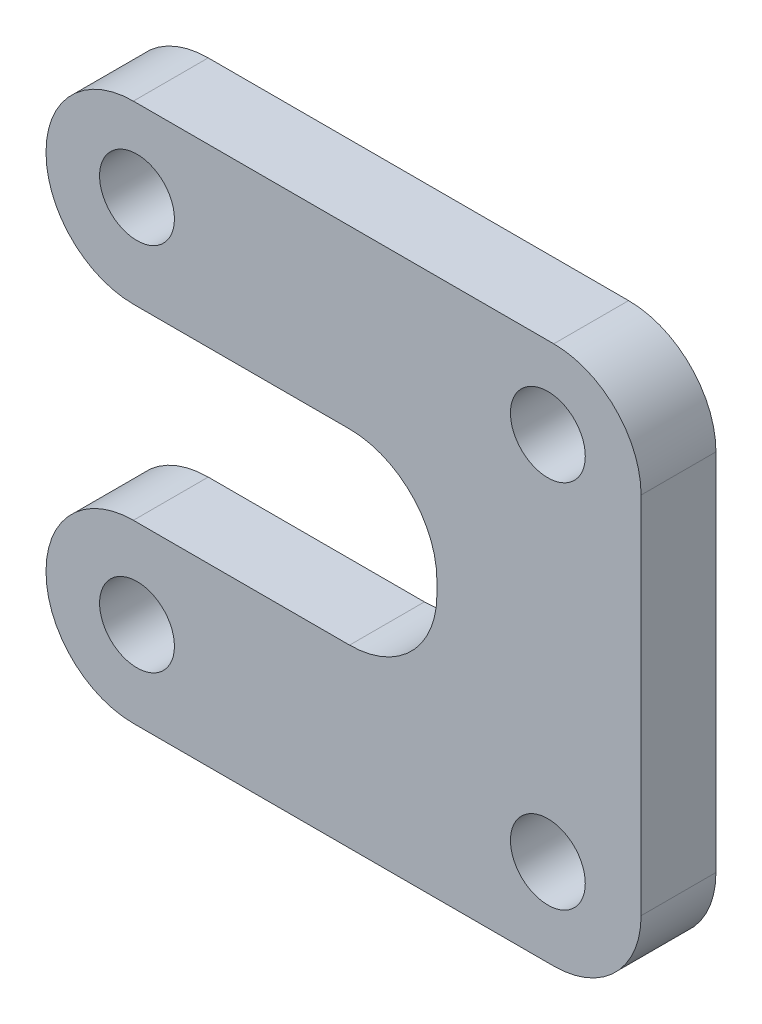
ISO-10303-21;
HEADER;
FILE_DESCRIPTION(('STEP AP214'),'2;1');
FILE_NAME('part.step','',(''),(''),'','','');
FILE_SCHEMA(('AUTOMOTIVE_DESIGN { 1 0 10303 214 1 1 1 1 }'));
ENDSEC;
DATA;
#1=APPLICATION_CONTEXT('core data for automotive mechanical design processes');
#2=APPLICATION_PROTOCOL_DEFINITION('international standard','automotive_design',2000,#1);
#3=PRODUCT_CONTEXT('',#1,'mechanical');
#4=PRODUCT('Part','Part','',(#3));
#5=PRODUCT_RELATED_PRODUCT_CATEGORY('part','',(#4));
#6=PRODUCT_DEFINITION_FORMATION('','',#4);
#7=PRODUCT_DEFINITION_CONTEXT('part definition',#1,'design');
#8=PRODUCT_DEFINITION('design','',#6,#7);
#9=PRODUCT_DEFINITION_SHAPE('','',#8);
#10=(LENGTH_UNIT() NAMED_UNIT(*) SI_UNIT(.MILLI.,.METRE.));
#11=(NAMED_UNIT(*) PLANE_ANGLE_UNIT() SI_UNIT($,.RADIAN.));
#12=(NAMED_UNIT(*) SI_UNIT($,.STERADIAN.) SOLID_ANGLE_UNIT());
#13=UNCERTAINTY_MEASURE_WITH_UNIT(LENGTH_MEASURE(1.E-05),#10,'distance_accuracy_value','');
#14=(GEOMETRIC_REPRESENTATION_CONTEXT(3) GLOBAL_UNCERTAINTY_ASSIGNED_CONTEXT((#13)) GLOBAL_UNIT_ASSIGNED_CONTEXT((#10,
#11,#12)) REPRESENTATION_CONTEXT('',''));
#15=CARTESIAN_POINT('',(0.,0.,0.));
#16=DIRECTION('',(0.,0.,1.));
#17=DIRECTION('',(1.,0.,0.));
#18=AXIS2_PLACEMENT_3D('',#15,#16,#17);
#19=CARTESIAN_POINT('',(-55.9788218979628,12.3294227323446,6.));
#20=DIRECTION('',(0.,0.,-1.));
#21=DIRECTION('',(-1.,0.,0.));
#22=AXIS2_PLACEMENT_3D('',#19,#20,#21);
#23=CYLINDRICAL_SURFACE('',#22,6.99999999999999);
#24=CARTESIAN_POINT('',(-55.9788218979628,12.3294227323446,0.));
#25=DIRECTION('',(0.,0.,1.));
#26=DIRECTION('',(1.,0.,0.));
#27=AXIS2_PLACEMENT_3D('',#24,#25,#26);
#28=CIRCLE('',#27,6.99999999999999);
#29=CARTESIAN_POINT('',(-55.9788218979628,5.32942273234464,0.));
#30=VERTEX_POINT('',#29);
#31=CARTESIAN_POINT('',(-48.9788218979628,12.3294227323446,0.));
#32=VERTEX_POINT('',#31);
#33=EDGE_CURVE('E179',#30,#32,#28,.T.);
#34=ORIENTED_EDGE('',*,*,#33,.T.);
#35=DIRECTION('',(0.,0.,-1.));
#36=VECTOR('',#35,1.);
#37=CARTESIAN_POINT('',(-48.9788218979628,12.3294227323446,6.));
#38=LINE('',#37,#36);
#39=CARTESIAN_POINT('',(-48.9788218979628,12.3294227323446,6.));
#40=VERTEX_POINT('',#39);
#41=EDGE_CURVE('E11',#40,#32,#38,.T.);
#42=ORIENTED_EDGE('',*,*,#41,.F.);
#43=CARTESIAN_POINT('',(-55.9788218979628,12.3294227323446,6.));
#44=DIRECTION('',(0.,0.,1.));
#45=DIRECTION('',(1.,0.,0.));
#46=AXIS2_PLACEMENT_3D('',#43,#44,#45);
#47=CIRCLE('',#46,6.99999999999999);
#48=CARTESIAN_POINT('',(-55.9788218979628,5.32942273234464,6.));
#49=VERTEX_POINT('',#48);
#50=EDGE_CURVE('E209',#49,#40,#47,.T.);
#51=ORIENTED_EDGE('',*,*,#50,.F.);
#52=DIRECTION('',(0.,0.,-1.));
#53=VECTOR('',#52,1.);
#54=CARTESIAN_POINT('',(-55.9788218979628,5.32942273234464,6.));
#55=LINE('',#54,#53);
#56=EDGE_CURVE('E175',#49,#30,#55,.T.);
#57=ORIENTED_EDGE('',*,*,#56,.T.);
#58=EDGE_LOOP('',(#34,#42,#51,#57));
#59=FACE_BOUND('',#58,.T.);
#60=ADVANCED_FACE('F33',(#59),#23,.T.);
#61=CARTESIAN_POINT('',(-48.9788218979628,41.5294227323447,6.));
#62=DIRECTION('',(-1.,0.,0.));
#63=DIRECTION('',(0.,-1.,0.));
#64=AXIS2_PLACEMENT_3D('',#61,#62,#63);
#65=PLANE('',#64);
#66=DIRECTION('',(0.,1.,0.));
#67=VECTOR('',#66,1.);
#68=CARTESIAN_POINT('',(-48.9788218979628,41.5294227323447,0.));
#69=LINE('',#68,#67);
#70=CARTESIAN_POINT('',(-48.9788218979628,41.5294227323447,0.));
#71=VERTEX_POINT('',#70);
#72=EDGE_CURVE('E182',#32,#71,#69,.T.);
#73=ORIENTED_EDGE('',*,*,#72,.T.);
#74=DIRECTION('',(0.,0.,-1.));
#75=VECTOR('',#74,1.);
#76=CARTESIAN_POINT('',(-48.9788218979628,41.5294227323447,6.));
#77=LINE('',#76,#75);
#78=CARTESIAN_POINT('',(-48.9788218979628,41.5294227323447,6.));
#79=VERTEX_POINT('',#78);
#80=EDGE_CURVE('E42',#79,#71,#77,.T.);
#81=ORIENTED_EDGE('',*,*,#80,.F.);
#82=DIRECTION('',(0.,1.,0.));
#83=VECTOR('',#82,1.);
#84=CARTESIAN_POINT('',(-48.9788218979628,41.5294227323447,6.));
#85=LINE('',#84,#83);
#86=EDGE_CURVE('E118',#40,#79,#85,.T.);
#87=ORIENTED_EDGE('',*,*,#86,.F.);
#88=ORIENTED_EDGE('',*,*,#41,.T.);
#89=EDGE_LOOP('',(#73,#81,#87,#88));
#90=FACE_BOUND('',#89,.T.);
#91=ADVANCED_FACE('F274',(#90),#65,.F.);
#92=CARTESIAN_POINT('',(-55.9788218979628,41.5294227323447,6.));
#93=DIRECTION('',(0.,0.,-1.));
#94=DIRECTION('',(-1.,0.,0.));
#95=AXIS2_PLACEMENT_3D('',#92,#93,#94);
#96=CYLINDRICAL_SURFACE('',#95,6.99999999999999);
#97=CARTESIAN_POINT('',(-55.9788218979628,41.5294227323447,0.));
#98=DIRECTION('',(0.,0.,1.));
#99=DIRECTION('',(-1.,0.,0.));
#100=AXIS2_PLACEMENT_3D('',#97,#98,#99);
#101=CIRCLE('',#100,6.99999999999999);
#102=CARTESIAN_POINT('',(-55.9788218979628,48.5294227323447,0.));
#103=VERTEX_POINT('',#102);
#104=EDGE_CURVE('E184',#71,#103,#101,.T.);
#105=ORIENTED_EDGE('',*,*,#104,.T.);
#106=DIRECTION('',(0.,0.,-1.));
#107=VECTOR('',#106,1.);
#108=CARTESIAN_POINT('',(-55.9788218979628,48.5294227323447,6.));
#109=LINE('',#108,#107);
#110=CARTESIAN_POINT('',(-55.9788218979628,48.5294227323447,6.));
#111=VERTEX_POINT('',#110);
#112=EDGE_CURVE('E240',#111,#103,#109,.T.);
#113=ORIENTED_EDGE('',*,*,#112,.F.);
#114=CARTESIAN_POINT('',(-55.9788218979628,41.5294227323447,6.));
#115=DIRECTION('',(0.,0.,1.));
#116=DIRECTION('',(-1.,0.,0.));
#117=AXIS2_PLACEMENT_3D('',#114,#115,#116);
#118=CIRCLE('',#117,6.99999999999999);
#119=EDGE_CURVE('E289',#79,#111,#118,.T.);
#120=ORIENTED_EDGE('',*,*,#119,.F.);
#121=ORIENTED_EDGE('',*,*,#80,.T.);
#122=EDGE_LOOP('',(#105,#113,#120,#121));
#123=FACE_BOUND('',#122,.T.);
#124=ADVANCED_FACE('F279',(#123),#96,.T.);
#125=CARTESIAN_POINT('',(-89.675181291429,48.5294227323447,6.));
#126=DIRECTION('',(0.,-1.,0.));
#127=DIRECTION('',(0.,0.,-1.));
#128=AXIS2_PLACEMENT_3D('',#125,#126,#127);
#129=PLANE('',#128);
#130=DIRECTION('',(-1.,0.,0.));
#131=VECTOR('',#130,1.);
#132=CARTESIAN_POINT('',(-89.675181291429,48.5294227323447,0.));
#133=LINE('',#132,#131);
#134=CARTESIAN_POINT('',(-89.675181291429,48.5294227323447,0.));
#135=VERTEX_POINT('',#134);
#136=EDGE_CURVE('E186',#103,#135,#133,.T.);
#137=ORIENTED_EDGE('',*,*,#136,.T.);
#138=DIRECTION('',(0.,0.,-1.));
#139=VECTOR('',#138,1.);
#140=CARTESIAN_POINT('',(-89.675181291429,48.5294227323447,6.));
#141=LINE('',#140,#139);
#142=CARTESIAN_POINT('',(-89.675181291429,48.5294227323447,6.));
#143=VERTEX_POINT('',#142);
#144=EDGE_CURVE('E237',#143,#135,#141,.T.);
#145=ORIENTED_EDGE('',*,*,#144,.F.);
#146=DIRECTION('',(-1.,0.,0.));
#147=VECTOR('',#146,1.);
#148=CARTESIAN_POINT('',(-89.675181291429,48.5294227323447,6.));
#149=LINE('',#148,#147);
#150=EDGE_CURVE('E291',#111,#143,#149,.T.);
#151=ORIENTED_EDGE('',*,*,#150,.F.);
#152=ORIENTED_EDGE('',*,*,#112,.T.);
#153=EDGE_LOOP('',(#137,#145,#151,#152));
#154=FACE_BOUND('',#153,.T.);
#155=ADVANCED_FACE('F357',(#154),#129,.F.);
#156=CARTESIAN_POINT('',(-89.675181291429,41.5294227323446,6.));
#157=DIRECTION('',(0.,0.,-1.));
#158=DIRECTION('',(-1.,0.,0.));
#159=AXIS2_PLACEMENT_3D('',#156,#157,#158);
#160=CYLINDRICAL_SURFACE('',#159,7.00000000000004);
#161=CARTESIAN_POINT('',(-89.675181291429,41.5294227323446,0.));
#162=DIRECTION('',(0.,0.,1.));
#163=DIRECTION('',(1.,0.,0.));
#164=AXIS2_PLACEMENT_3D('',#161,#162,#163);
#165=CIRCLE('',#164,7.00000000000004);
#166=CARTESIAN_POINT('',(-96.6751812914291,41.5294227323446,0.));
#167=VERTEX_POINT('',#166);
#168=EDGE_CURVE('E188',#135,#167,#165,.T.);
#169=ORIENTED_EDGE('',*,*,#168,.T.);
#170=DIRECTION('',(0.,0.,-1.));
#171=VECTOR('',#170,1.);
#172=CARTESIAN_POINT('',(-96.6751812914291,41.5294227323446,6.));
#173=LINE('',#172,#171);
#174=CARTESIAN_POINT('',(-96.6751812914291,41.5294227323446,6.));
#175=VERTEX_POINT('',#174);
#176=EDGE_CURVE('E234',#175,#167,#173,.T.);
#177=ORIENTED_EDGE('',*,*,#176,.F.);
#178=CARTESIAN_POINT('',(-89.675181291429,41.5294227323446,6.));
#179=DIRECTION('',(0.,0.,1.));
#180=DIRECTION('',(1.,0.,0.));
#181=AXIS2_PLACEMENT_3D('',#178,#179,#180);
#182=CIRCLE('',#181,7.00000000000004);
#183=EDGE_CURVE('E293',#143,#175,#182,.T.);
#184=ORIENTED_EDGE('',*,*,#183,.F.);
#185=ORIENTED_EDGE('',*,*,#144,.T.);
#186=EDGE_LOOP('',(#169,#177,#184,#185));
#187=FACE_BOUND('',#186,.T.);
#188=ADVANCED_FACE('F353',(#187),#160,.T.);
#189=CARTESIAN_POINT('',(-96.6751812914291,41.5294227323446,6.));
#190=DIRECTION('',(1.,0.,0.));
#191=DIRECTION('',(0.,0.,-1.));
#192=AXIS2_PLACEMENT_3D('',#189,#190,#191);
#193=PLANE('',#192);
#194=DIRECTION('',(0.,-1.,0.));
#195=VECTOR('',#194,1.);
#196=CARTESIAN_POINT('',(-96.6751812914291,41.5294227323446,0.));
#197=LINE('',#196,#195);
#198=CARTESIAN_POINT('',(-96.6751812914291,41.4294227323447,0.));
#199=VERTEX_POINT('',#198);
#200=EDGE_CURVE('E190',#167,#199,#197,.T.);
#201=ORIENTED_EDGE('',*,*,#200,.T.);
#202=DIRECTION('',(0.,0.,-1.));
#203=VECTOR('',#202,1.);
#204=CARTESIAN_POINT('',(-96.6751812914291,41.4294227323447,6.));
#205=LINE('',#204,#203);
#206=CARTESIAN_POINT('',(-96.6751812914291,41.4294227323447,6.));
#207=VERTEX_POINT('',#206);
#208=EDGE_CURVE('E231',#207,#199,#205,.T.);
#209=ORIENTED_EDGE('',*,*,#208,.F.);
#210=DIRECTION('',(0.,-1.,0.));
#211=VECTOR('',#210,1.);
#212=CARTESIAN_POINT('',(-96.6751812914291,41.5294227323446,6.));
#213=LINE('',#212,#211);
#214=EDGE_CURVE('E299',#175,#207,#213,.T.);
#215=ORIENTED_EDGE('',*,*,#214,.F.);
#216=ORIENTED_EDGE('',*,*,#176,.T.);
#217=EDGE_LOOP('',(#201,#209,#215,#216));
#218=FACE_BOUND('',#217,.T.);
#219=ADVANCED_FACE('F349',(#218),#193,.F.);
#220=CARTESIAN_POINT('',(-89.675181291429,41.4294227323447,6.));
#221=DIRECTION('',(0.,0.,-1.));
#222=DIRECTION('',(-1.,0.,0.));
#223=AXIS2_PLACEMENT_3D('',#220,#221,#222);
#224=CYLINDRICAL_SURFACE('',#223,7.00000000000004);
#225=CARTESIAN_POINT('',(-89.675181291429,41.4294227323447,0.));
#226=DIRECTION('',(0.,0.,1.));
#227=DIRECTION('',(1.,0.,0.));
#228=AXIS2_PLACEMENT_3D('',#225,#226,#227);
#229=CIRCLE('',#228,7.00000000000004);
#230=CARTESIAN_POINT('',(-89.675181291429,34.4294227323446,0.));
#231=VERTEX_POINT('',#230);
#232=EDGE_CURVE('E192',#199,#231,#229,.T.);
#233=ORIENTED_EDGE('',*,*,#232,.T.);
#234=DIRECTION('',(0.,0.,-1.));
#235=VECTOR('',#234,1.);
#236=CARTESIAN_POINT('',(-89.675181291429,34.4294227323446,6.));
#237=LINE('',#236,#235);
#238=CARTESIAN_POINT('',(-89.675181291429,34.4294227323446,6.));
#239=VERTEX_POINT('',#238);
#240=EDGE_CURVE('E228',#239,#231,#237,.T.);
#241=ORIENTED_EDGE('',*,*,#240,.F.);
#242=CARTESIAN_POINT('',(-89.675181291429,41.4294227323447,6.));
#243=DIRECTION('',(0.,0.,1.));
#244=DIRECTION('',(1.,0.,0.));
#245=AXIS2_PLACEMENT_3D('',#242,#243,#244);
#246=CIRCLE('',#245,7.00000000000004);
#247=EDGE_CURVE('E301',#207,#239,#246,.T.);
#248=ORIENTED_EDGE('',*,*,#247,.F.);
#249=ORIENTED_EDGE('',*,*,#208,.T.);
#250=EDGE_LOOP('',(#233,#241,#248,#249));
#251=FACE_BOUND('',#250,.T.);
#252=ADVANCED_FACE('F345',(#251),#224,.T.);
#253=CARTESIAN_POINT('',(-89.675181291429,34.4294227323446,6.));
#254=DIRECTION('',(0.,1.,0.));
#255=DIRECTION('',(0.,0.,1.));
#256=AXIS2_PLACEMENT_3D('',#253,#254,#255);
#257=PLANE('',#256);
#258=DIRECTION('',(1.,0.,0.));
#259=VECTOR('',#258,1.);
#260=CARTESIAN_POINT('',(-89.675181291429,34.4294227323446,0.));
#261=LINE('',#260,#259);
#262=CARTESIAN_POINT('',(-72.3464733788306,34.4294227323446,0.));
#263=VERTEX_POINT('',#262);
#264=EDGE_CURVE('E194',#231,#263,#261,.T.);
#265=ORIENTED_EDGE('',*,*,#264,.T.);
#266=DIRECTION('',(0.,0.,-1.));
#267=VECTOR('',#266,1.);
#268=CARTESIAN_POINT('',(-72.3464733788306,34.4294227323446,6.));
#269=LINE('',#268,#267);
#270=CARTESIAN_POINT('',(-72.3464733788306,34.4294227323446,6.));
#271=VERTEX_POINT('',#270);
#272=EDGE_CURVE('E225',#271,#263,#269,.T.);
#273=ORIENTED_EDGE('',*,*,#272,.F.);
#274=DIRECTION('',(1.,0.,0.));
#275=VECTOR('',#274,1.);
#276=CARTESIAN_POINT('',(-89.675181291429,34.4294227323446,6.));
#277=LINE('',#276,#275);
#278=EDGE_CURVE('E303',#239,#271,#277,.T.);
#279=ORIENTED_EDGE('',*,*,#278,.F.);
#280=ORIENTED_EDGE('',*,*,#240,.T.);
#281=EDGE_LOOP('',(#265,#273,#279,#280));
#282=FACE_BOUND('',#281,.T.);
#283=ADVANCED_FACE('F340',(#282),#257,.F.);
#284=CARTESIAN_POINT('',(-72.3464733788306,27.4294227323446,6.));
#285=DIRECTION('',(0.,0.,-1.));
#286=DIRECTION('',(-1.,0.,0.));
#287=AXIS2_PLACEMENT_3D('',#284,#285,#286);
#288=CYLINDRICAL_SURFACE('',#287,7.);
#289=CARTESIAN_POINT('',(-72.3464733788306,27.4294227323446,0.));
#290=DIRECTION('',(0.,0.,-1.));
#291=DIRECTION('',(-1.,0.,0.));
#292=AXIS2_PLACEMENT_3D('',#289,#290,#291);
#293=CIRCLE('',#292,7.);
#294=CARTESIAN_POINT('',(-65.3464733788306,27.4294227323446,0.));
#295=VERTEX_POINT('',#294);
#296=EDGE_CURVE('E196',#263,#295,#293,.T.);
#297=ORIENTED_EDGE('',*,*,#296,.T.);
#298=DIRECTION('',(0.,0.,-1.));
#299=VECTOR('',#298,1.);
#300=CARTESIAN_POINT('',(-65.3464733788306,27.4294227323446,6.));
#301=LINE('',#300,#299);
#302=CARTESIAN_POINT('',(-65.3464733788306,27.4294227323446,6.));
#303=VERTEX_POINT('',#302);
#304=EDGE_CURVE('E222',#303,#295,#301,.T.);
#305=ORIENTED_EDGE('',*,*,#304,.F.);
#306=CARTESIAN_POINT('',(-72.3464733788306,27.4294227323446,6.));
#307=DIRECTION('',(0.,0.,-1.));
#308=DIRECTION('',(-1.,0.,0.));
#309=AXIS2_PLACEMENT_3D('',#306,#307,#308);
#310=CIRCLE('',#309,7.);
#311=EDGE_CURVE('E305',#271,#303,#310,.T.);
#312=ORIENTED_EDGE('',*,*,#311,.F.);
#313=ORIENTED_EDGE('',*,*,#272,.T.);
#314=EDGE_LOOP('',(#297,#305,#312,#313));
#315=FACE_BOUND('',#314,.T.);
#316=ADVANCED_FACE('F334',(#315),#288,.F.);
#317=CARTESIAN_POINT('',(-65.3464733788306,27.4294227323446,6.));
#318=DIRECTION('',(1.,0.,0.));
#319=DIRECTION('',(0.,1.,0.));
#320=AXIS2_PLACEMENT_3D('',#317,#318,#319);
#321=PLANE('',#320);
#322=DIRECTION('',(0.,-1.,0.));
#323=VECTOR('',#322,1.);
#324=CARTESIAN_POINT('',(-65.3464733788306,27.4294227323446,0.));
#325=LINE('',#324,#323);
#326=CARTESIAN_POINT('',(-65.3464733788306,26.4294227323447,0.));
#327=VERTEX_POINT('',#326);
#328=EDGE_CURVE('E198',#295,#327,#325,.T.);
#329=ORIENTED_EDGE('',*,*,#328,.T.);
#330=DIRECTION('',(0.,0.,-1.));
#331=VECTOR('',#330,1.);
#332=CARTESIAN_POINT('',(-65.3464733788306,26.4294227323447,6.));
#333=LINE('',#332,#331);
#334=CARTESIAN_POINT('',(-65.3464733788306,26.4294227323447,6.));
#335=VERTEX_POINT('',#334);
#336=EDGE_CURVE('E219',#335,#327,#333,.T.);
#337=ORIENTED_EDGE('',*,*,#336,.F.);
#338=DIRECTION('',(0.,-1.,0.));
#339=VECTOR('',#338,1.);
#340=CARTESIAN_POINT('',(-65.3464733788306,27.4294227323446,6.));
#341=LINE('',#340,#339);
#342=EDGE_CURVE('E307',#303,#335,#341,.T.);
#343=ORIENTED_EDGE('',*,*,#342,.F.);
#344=ORIENTED_EDGE('',*,*,#304,.T.);
#345=EDGE_LOOP('',(#329,#337,#343,#344));
#346=FACE_BOUND('',#345,.T.);
#347=ADVANCED_FACE('F330',(#346),#321,.F.);
#348=CARTESIAN_POINT('',(-72.3464733788306,26.4294227323447,6.));
#349=DIRECTION('',(0.,0.,-1.));
#350=DIRECTION('',(-1.,0.,0.));
#351=AXIS2_PLACEMENT_3D('',#348,#349,#350);
#352=CYLINDRICAL_SURFACE('',#351,6.99999999999999);
#353=CARTESIAN_POINT('',(-72.3464733788306,26.4294227323447,0.));
#354=DIRECTION('',(0.,0.,-1.));
#355=DIRECTION('',(-1.,0.,0.));
#356=AXIS2_PLACEMENT_3D('',#353,#354,#355);
#357=CIRCLE('',#356,6.99999999999999);
#358=CARTESIAN_POINT('',(-72.3464733788306,19.4294227323447,0.));
#359=VERTEX_POINT('',#358);
#360=EDGE_CURVE('E200',#327,#359,#357,.T.);
#361=ORIENTED_EDGE('',*,*,#360,.T.);
#362=DIRECTION('',(0.,0.,-1.));
#363=VECTOR('',#362,1.);
#364=CARTESIAN_POINT('',(-72.3464733788306,19.4294227323447,6.));
#365=LINE('',#364,#363);
#366=CARTESIAN_POINT('',(-72.3464733788306,19.4294227323447,6.));
#367=VERTEX_POINT('',#366);
#368=EDGE_CURVE('E216',#367,#359,#365,.T.);
#369=ORIENTED_EDGE('',*,*,#368,.F.);
#370=CARTESIAN_POINT('',(-72.3464733788306,26.4294227323447,6.));
#371=DIRECTION('',(0.,0.,-1.));
#372=DIRECTION('',(-1.,0.,0.));
#373=AXIS2_PLACEMENT_3D('',#370,#371,#372);
#374=CIRCLE('',#373,6.99999999999999);
#375=EDGE_CURVE('E309',#335,#367,#374,.T.);
#376=ORIENTED_EDGE('',*,*,#375,.F.);
#377=ORIENTED_EDGE('',*,*,#336,.T.);
#378=EDGE_LOOP('',(#361,#369,#376,#377));
#379=FACE_BOUND('',#378,.T.);
#380=ADVANCED_FACE('F326',(#379),#352,.F.);
#381=CARTESIAN_POINT('',(-89.675181291429,19.4294227323447,6.));
#382=DIRECTION('',(0.,-1.,0.));
#383=DIRECTION('',(1.,0.,0.));
#384=AXIS2_PLACEMENT_3D('',#381,#382,#383);
#385=PLANE('',#384);
#386=DIRECTION('',(-1.,0.,0.));
#387=VECTOR('',#386,1.);
#388=CARTESIAN_POINT('',(-89.675181291429,19.4294227323447,0.));
#389=LINE('',#388,#387);
#390=CARTESIAN_POINT('',(-89.675181291429,19.4294227323447,0.));
#391=VERTEX_POINT('',#390);
#392=EDGE_CURVE('E202',#359,#391,#389,.T.);
#393=ORIENTED_EDGE('',*,*,#392,.T.);
#394=DIRECTION('',(0.,0.,-1.));
#395=VECTOR('',#394,1.);
#396=CARTESIAN_POINT('',(-89.675181291429,19.4294227323447,6.));
#397=LINE('',#396,#395);
#398=CARTESIAN_POINT('',(-89.675181291429,19.4294227323447,6.));
#399=VERTEX_POINT('',#398);
#400=EDGE_CURVE('E213',#399,#391,#397,.T.);
#401=ORIENTED_EDGE('',*,*,#400,.F.);
#402=DIRECTION('',(-1.,0.,0.));
#403=VECTOR('',#402,1.);
#404=CARTESIAN_POINT('',(-89.675181291429,19.4294227323447,6.));
#405=LINE('',#404,#403);
#406=EDGE_CURVE('E311',#367,#399,#405,.T.);
#407=ORIENTED_EDGE('',*,*,#406,.F.);
#408=ORIENTED_EDGE('',*,*,#368,.T.);
#409=EDGE_LOOP('',(#393,#401,#407,#408));
#410=FACE_BOUND('',#409,.T.);
#411=ADVANCED_FACE('F317',(#410),#385,.F.);
#412=CARTESIAN_POINT('',(-89.675181291429,12.4294227323447,6.));
#413=DIRECTION('',(0.,0.,-1.));
#414=DIRECTION('',(-1.,0.,0.));
#415=AXIS2_PLACEMENT_3D('',#412,#413,#414);
#416=CYLINDRICAL_SURFACE('',#415,7.00000000000005);
#417=CARTESIAN_POINT('',(-89.675181291429,12.4294227323447,0.));
#418=DIRECTION('',(0.,0.,1.));
#419=DIRECTION('',(1.,0.,0.));
#420=AXIS2_PLACEMENT_3D('',#417,#418,#419);
#421=CIRCLE('',#420,7.00000000000005);
#422=CARTESIAN_POINT('',(-96.6751812914291,12.4294227323447,0.));
#423=VERTEX_POINT('',#422);
#424=EDGE_CURVE('E204',#391,#423,#421,.T.);
#425=ORIENTED_EDGE('',*,*,#424,.T.);
#426=DIRECTION('',(0.,0.,-1.));
#427=VECTOR('',#426,1.);
#428=CARTESIAN_POINT('',(-96.6751812914291,12.4294227323447,6.));
#429=LINE('',#428,#427);
#430=CARTESIAN_POINT('',(-96.6751812914291,12.4294227323447,6.));
#431=VERTEX_POINT('',#430);
#432=EDGE_CURVE('E170',#431,#423,#429,.T.);
#433=ORIENTED_EDGE('',*,*,#432,.F.);
#434=CARTESIAN_POINT('',(-89.675181291429,12.4294227323447,6.));
#435=DIRECTION('',(0.,0.,1.));
#436=DIRECTION('',(1.,0.,0.));
#437=AXIS2_PLACEMENT_3D('',#434,#435,#436);
#438=CIRCLE('',#437,7.00000000000005);
#439=EDGE_CURVE('E161',#399,#431,#438,.T.);
#440=ORIENTED_EDGE('',*,*,#439,.F.);
#441=ORIENTED_EDGE('',*,*,#400,.T.);
#442=EDGE_LOOP('',(#425,#433,#440,#441));
#443=FACE_BOUND('',#442,.T.);
#444=ADVANCED_FACE('F321',(#443),#416,.T.);
#445=CARTESIAN_POINT('',(-96.6751812914291,12.4294227323447,6.));
#446=DIRECTION('',(1.,0.,0.));
#447=DIRECTION('',(0.,0.,-1.));
#448=AXIS2_PLACEMENT_3D('',#445,#446,#447);
#449=PLANE('',#448);
#450=DIRECTION('',(0.,-1.,0.));
#451=VECTOR('',#450,1.);
#452=CARTESIAN_POINT('',(-96.6751812914291,12.4294227323447,0.));
#453=LINE('',#452,#451);
#454=CARTESIAN_POINT('',(-96.6751812914291,12.3294227323447,0.));
#455=VERTEX_POINT('',#454);
#456=EDGE_CURVE('E169',#423,#455,#453,.T.);
#457=ORIENTED_EDGE('',*,*,#456,.T.);
#458=DIRECTION('',(0.,0.,-1.));
#459=VECTOR('',#458,1.);
#460=CARTESIAN_POINT('',(-96.6751812914291,12.3294227323447,6.));
#461=LINE('',#460,#459);
#462=CARTESIAN_POINT('',(-96.6751812914291,12.3294227323447,6.));
#463=VERTEX_POINT('',#462);
#464=EDGE_CURVE('E166',#463,#455,#461,.T.);
#465=ORIENTED_EDGE('',*,*,#464,.F.);
#466=DIRECTION('',(0.,-1.,0.));
#467=VECTOR('',#466,1.);
#468=CARTESIAN_POINT('',(-96.6751812914291,12.4294227323447,6.));
#469=LINE('',#468,#467);
#470=EDGE_CURVE('E155',#431,#463,#469,.T.);
#471=ORIENTED_EDGE('',*,*,#470,.F.);
#472=ORIENTED_EDGE('',*,*,#432,.T.);
#473=EDGE_LOOP('',(#457,#465,#471,#472));
#474=FACE_BOUND('',#473,.T.);
#475=ADVANCED_FACE('F167',(#474),#449,.F.);
#476=CARTESIAN_POINT('',(-89.675181291429,12.3294227323447,6.));
#477=DIRECTION('',(0.,0.,-1.));
#478=DIRECTION('',(-1.,0.,0.));
#479=AXIS2_PLACEMENT_3D('',#476,#477,#478);
#480=CYLINDRICAL_SURFACE('',#479,7.00000000000005);
#481=CARTESIAN_POINT('',(-89.675181291429,12.3294227323447,0.));
#482=DIRECTION('',(0.,0.,1.));
#483=DIRECTION('',(1.,0.,0.));
#484=AXIS2_PLACEMENT_3D('',#481,#482,#483);
#485=CIRCLE('',#484,7.00000000000005);
#486=CARTESIAN_POINT('',(-89.675181291429,5.32942273234464,0.));
#487=VERTEX_POINT('',#486);
#488=EDGE_CURVE('E104',#455,#487,#485,.T.);
#489=ORIENTED_EDGE('',*,*,#488,.T.);
#490=DIRECTION('',(0.,0.,-1.));
#491=VECTOR('',#490,1.);
#492=CARTESIAN_POINT('',(-89.675181291429,5.32942273234464,6.));
#493=LINE('',#492,#491);
#494=CARTESIAN_POINT('',(-89.675181291429,5.32942273234464,6.));
#495=VERTEX_POINT('',#494);
#496=EDGE_CURVE('E171',#495,#487,#493,.T.);
#497=ORIENTED_EDGE('',*,*,#496,.F.);
#498=CARTESIAN_POINT('',(-89.675181291429,12.3294227323447,6.));
#499=DIRECTION('',(0.,0.,1.));
#500=DIRECTION('',(1.,0.,0.));
#501=AXIS2_PLACEMENT_3D('',#498,#499,#500);
#502=CIRCLE('',#501,7.00000000000005);
#503=EDGE_CURVE('E159',#463,#495,#502,.T.);
#504=ORIENTED_EDGE('',*,*,#503,.F.);
#505=ORIENTED_EDGE('',*,*,#464,.T.);
#506=EDGE_LOOP('',(#489,#497,#504,#505));
#507=FACE_BOUND('',#506,.T.);
#508=ADVANCED_FACE('F173',(#507),#480,.T.);
#509=CARTESIAN_POINT('',(-55.9788218979628,5.32942273234464,6.));
#510=DIRECTION('',(0.,1.,0.));
#511=DIRECTION('',(-1.,0.,0.));
#512=AXIS2_PLACEMENT_3D('',#509,#510,#511);
#513=PLANE('',#512);
#514=DIRECTION('',(1.,0.,0.));
#515=VECTOR('',#514,1.);
#516=CARTESIAN_POINT('',(-55.9788218979628,5.32942273234464,0.));
#517=LINE('',#516,#515);
#518=EDGE_CURVE('E110',#487,#30,#517,.T.);
#519=ORIENTED_EDGE('',*,*,#518,.T.);
#520=ORIENTED_EDGE('',*,*,#56,.F.);
#521=DIRECTION('',(1.,0.,0.));
#522=VECTOR('',#521,1.);
#523=CARTESIAN_POINT('',(-55.9788218979628,5.32942273234464,6.));
#524=LINE('',#523,#522);
#525=EDGE_CURVE('E51',#495,#49,#524,.T.);
#526=ORIENTED_EDGE('',*,*,#525,.F.);
#527=ORIENTED_EDGE('',*,*,#496,.T.);
#528=EDGE_LOOP('',(#519,#520,#526,#527));
#529=FACE_BOUND('',#528,.T.);
#530=ADVANCED_FACE('F387',(#529),#513,.F.);
#531=CARTESIAN_POINT('',(-55.9788218979628,12.3294227323446,6.));
#532=DIRECTION('',(0.,0.,1.));
#533=DIRECTION('',(1.,0.,0.));
#534=AXIS2_PLACEMENT_3D('',#531,#532,#533);
#535=PLANE('',#534);
#536=CARTESIAN_POINT('',(-89.385397691015,12.3294227323446,6.));
#537=DIRECTION('',(0.,0.,1.));
#538=DIRECTION('',(1.,0.,0.));
#539=AXIS2_PLACEMENT_3D('',#536,#537,#538);
#540=CIRCLE('',#539,3.00000000000001);
#541=CARTESIAN_POINT('',(-86.385397691015,12.3294227323446,6.));
#542=VERTEX_POINT('',#541);
#543=EDGE_CURVE('E415',#542,#542,#540,.T.);
#544=ORIENTED_EDGE('',*,*,#543,.F.);
#545=EDGE_LOOP('',(#544));
#546=FACE_BOUND('',#545,.T.);
#547=CARTESIAN_POINT('',(-56.4519087761959,12.3294227323446,6.));
#548=DIRECTION('',(0.,0.,1.));
#549=DIRECTION('',(1.,0.,0.));
#550=AXIS2_PLACEMENT_3D('',#547,#548,#549);
#551=CIRCLE('',#550,3.00000000000001);
#552=CARTESIAN_POINT('',(-53.4519087761959,12.3294227323446,6.));
#553=VERTEX_POINT('',#552);
#554=EDGE_CURVE('E412',#553,#553,#551,.T.);
#555=ORIENTED_EDGE('',*,*,#554,.F.);
#556=EDGE_LOOP('',(#555));
#557=FACE_BOUND('',#556,.T.);
#558=CARTESIAN_POINT('',(-56.4519087761959,41.9908420598084,6.));
#559=DIRECTION('',(0.,0.,1.));
#560=DIRECTION('',(1.,0.,0.));
#561=AXIS2_PLACEMENT_3D('',#558,#559,#560);
#562=CIRCLE('',#561,3.00000000000001);
#563=CARTESIAN_POINT('',(-53.4519087761959,41.9908420598084,6.));
#564=VERTEX_POINT('',#563);
#565=EDGE_CURVE('E409',#564,#564,#562,.T.);
#566=ORIENTED_EDGE('',*,*,#565,.F.);
#567=EDGE_LOOP('',(#566));
#568=FACE_BOUND('',#567,.T.);
#569=CARTESIAN_POINT('',(-89.385397691015,41.9908420598084,6.));
#570=DIRECTION('',(0.,0.,1.));
#571=DIRECTION('',(1.,0.,0.));
#572=AXIS2_PLACEMENT_3D('',#569,#570,#571);
#573=CIRCLE('',#572,3.00000000000001);
#574=CARTESIAN_POINT('',(-86.385397691015,41.9908420598084,6.));
#575=VERTEX_POINT('',#574);
#576=EDGE_CURVE('E249',#575,#575,#573,.T.);
#577=ORIENTED_EDGE('',*,*,#576,.F.);
#578=EDGE_LOOP('',(#577));
#579=FACE_BOUND('',#578,.T.);
#580=ORIENTED_EDGE('',*,*,#50,.T.);
#581=ORIENTED_EDGE('',*,*,#86,.T.);
#582=ORIENTED_EDGE('',*,*,#119,.T.);
#583=ORIENTED_EDGE('',*,*,#150,.T.);
#584=ORIENTED_EDGE('',*,*,#183,.T.);
#585=ORIENTED_EDGE('',*,*,#214,.T.);
#586=ORIENTED_EDGE('',*,*,#247,.T.);
#587=ORIENTED_EDGE('',*,*,#278,.T.);
#588=ORIENTED_EDGE('',*,*,#311,.T.);
#589=ORIENTED_EDGE('',*,*,#342,.T.);
#590=ORIENTED_EDGE('',*,*,#375,.T.);
#591=ORIENTED_EDGE('',*,*,#406,.T.);
#592=ORIENTED_EDGE('',*,*,#439,.T.);
#593=ORIENTED_EDGE('',*,*,#470,.T.);
#594=ORIENTED_EDGE('',*,*,#503,.T.);
#595=ORIENTED_EDGE('',*,*,#525,.T.);
#596=EDGE_LOOP('',(#580,#581,#582,#583,#584,#585,#586,#587,#588,#589,#590,#591,#592,#593,#594,#595));
#597=FACE_BOUND('',#596,.T.);
#598=ADVANCED_FACE('F157',(#546,#557,#568,#579,#597),#535,.T.);
#599=CARTESIAN_POINT('',(-55.9788218979628,12.3294227323446,0.));
#600=DIRECTION('',(0.,0.,1.));
#601=DIRECTION('',(1.,0.,0.));
#602=AXIS2_PLACEMENT_3D('',#599,#600,#601);
#603=PLANE('',#602);
#604=CARTESIAN_POINT('',(-89.385397691015,12.3294227323446,0.));
#605=DIRECTION('',(0.,0.,1.));
#606=DIRECTION('',(1.,0.,0.));
#607=AXIS2_PLACEMENT_3D('',#604,#605,#606);
#608=CIRCLE('',#607,3.00000000000001);
#609=CARTESIAN_POINT('',(-86.385397691015,12.3294227323446,0.));
#610=VERTEX_POINT('',#609);
#611=EDGE_CURVE('E36',#610,#610,#608,.T.);
#612=ORIENTED_EDGE('',*,*,#611,.T.);
#613=EDGE_LOOP('',(#612));
#614=FACE_BOUND('',#613,.T.);
#615=CARTESIAN_POINT('',(-56.4519087761959,12.3294227323446,0.));
#616=DIRECTION('',(0.,0.,1.));
#617=DIRECTION('',(1.,0.,0.));
#618=AXIS2_PLACEMENT_3D('',#615,#616,#617);
#619=CIRCLE('',#618,3.00000000000001);
#620=CARTESIAN_POINT('',(-53.4519087761959,12.3294227323446,0.));
#621=VERTEX_POINT('',#620);
#622=EDGE_CURVE('E251',#621,#621,#619,.T.);
#623=ORIENTED_EDGE('',*,*,#622,.T.);
#624=EDGE_LOOP('',(#623));
#625=FACE_BOUND('',#624,.T.);
#626=CARTESIAN_POINT('',(-56.4519087761959,41.9908420598084,0.));
#627=DIRECTION('',(0.,0.,1.));
#628=DIRECTION('',(1.,0.,0.));
#629=AXIS2_PLACEMENT_3D('',#626,#627,#628);
#630=CIRCLE('',#629,3.00000000000001);
#631=CARTESIAN_POINT('',(-53.4519087761959,41.9908420598084,0.));
#632=VERTEX_POINT('',#631);
#633=EDGE_CURVE('E248',#632,#632,#630,.T.);
#634=ORIENTED_EDGE('',*,*,#633,.T.);
#635=EDGE_LOOP('',(#634));
#636=FACE_BOUND('',#635,.T.);
#637=CARTESIAN_POINT('',(-89.385397691015,41.9908420598084,0.));
#638=DIRECTION('',(0.,0.,1.));
#639=DIRECTION('',(1.,0.,0.));
#640=AXIS2_PLACEMENT_3D('',#637,#638,#639);
#641=CIRCLE('',#640,3.00000000000001);
#642=CARTESIAN_POINT('',(-86.385397691015,41.9908420598084,0.));
#643=VERTEX_POINT('',#642);
#644=EDGE_CURVE('E245',#643,#643,#641,.T.);
#645=ORIENTED_EDGE('',*,*,#644,.T.);
#646=EDGE_LOOP('',(#645));
#647=FACE_BOUND('',#646,.T.);
#648=ORIENTED_EDGE('',*,*,#33,.F.);
#649=ORIENTED_EDGE('',*,*,#518,.F.);
#650=ORIENTED_EDGE('',*,*,#488,.F.);
#651=ORIENTED_EDGE('',*,*,#456,.F.);
#652=ORIENTED_EDGE('',*,*,#424,.F.);
#653=ORIENTED_EDGE('',*,*,#392,.F.);
#654=ORIENTED_EDGE('',*,*,#360,.F.);
#655=ORIENTED_EDGE('',*,*,#328,.F.);
#656=ORIENTED_EDGE('',*,*,#296,.F.);
#657=ORIENTED_EDGE('',*,*,#264,.F.);
#658=ORIENTED_EDGE('',*,*,#232,.F.);
#659=ORIENTED_EDGE('',*,*,#200,.F.);
#660=ORIENTED_EDGE('',*,*,#168,.F.);
#661=ORIENTED_EDGE('',*,*,#136,.F.);
#662=ORIENTED_EDGE('',*,*,#104,.F.);
#663=ORIENTED_EDGE('',*,*,#72,.F.);
#664=EDGE_LOOP('',(#648,#649,#650,#651,#652,#653,#654,#655,#656,#657,#658,#659,#660,#661,#662,#663));
#665=FACE_BOUND('',#664,.T.);
#666=ADVANCED_FACE('F258',(#614,#625,#636,#647,#665),#603,.F.);
#667=CARTESIAN_POINT('',(-89.385397691015,41.9908420598084,-4.));
#668=DIRECTION('',(0.,0.,1.));
#669=DIRECTION('',(1.,0.,0.));
#670=AXIS2_PLACEMENT_3D('',#667,#668,#669);
#671=CYLINDRICAL_SURFACE('',#670,3.00000000000001);
#672=ORIENTED_EDGE('',*,*,#576,.T.);
#673=EDGE_LOOP('',(#672));
#674=FACE_BOUND('',#673,.T.);
#675=ORIENTED_EDGE('',*,*,#644,.F.);
#676=EDGE_LOOP('',(#675));
#677=FACE_BOUND('',#676,.T.);
#678=ADVANCED_FACE('F392',(#674,#677),#671,.F.);
#679=CARTESIAN_POINT('',(-56.4519087761959,41.9908420598084,-4.));
#680=DIRECTION('',(0.,0.,1.));
#681=DIRECTION('',(1.,0.,0.));
#682=AXIS2_PLACEMENT_3D('',#679,#680,#681);
#683=CYLINDRICAL_SURFACE('',#682,3.00000000000001);
#684=ORIENTED_EDGE('',*,*,#565,.T.);
#685=EDGE_LOOP('',(#684));
#686=FACE_BOUND('',#685,.T.);
#687=ORIENTED_EDGE('',*,*,#633,.F.);
#688=EDGE_LOOP('',(#687));
#689=FACE_BOUND('',#688,.T.);
#690=ADVANCED_FACE('F268',(#686,#689),#683,.F.);
#691=CARTESIAN_POINT('',(-56.4519087761959,12.3294227323446,-4.));
#692=DIRECTION('',(0.,0.,1.));
#693=DIRECTION('',(1.,0.,0.));
#694=AXIS2_PLACEMENT_3D('',#691,#692,#693);
#695=CYLINDRICAL_SURFACE('',#694,3.00000000000001);
#696=ORIENTED_EDGE('',*,*,#554,.T.);
#697=EDGE_LOOP('',(#696));
#698=FACE_BOUND('',#697,.T.);
#699=ORIENTED_EDGE('',*,*,#622,.F.);
#700=EDGE_LOOP('',(#699));
#701=FACE_BOUND('',#700,.T.);
#702=ADVANCED_FACE('F262',(#698,#701),#695,.F.);
#703=CARTESIAN_POINT('',(-89.385397691015,12.3294227323446,-4.));
#704=DIRECTION('',(0.,0.,1.));
#705=DIRECTION('',(1.,0.,0.));
#706=AXIS2_PLACEMENT_3D('',#703,#704,#705);
#707=CYLINDRICAL_SURFACE('',#706,3.00000000000001);
#708=ORIENTED_EDGE('',*,*,#543,.T.);
#709=EDGE_LOOP('',(#708));
#710=FACE_BOUND('',#709,.T.);
#711=ORIENTED_EDGE('',*,*,#611,.F.);
#712=EDGE_LOOP('',(#711));
#713=FACE_BOUND('',#712,.T.);
#714=ADVANCED_FACE('F260',(#710,#713),#707,.F.);
#715=CLOSED_SHELL('',(#60,#91,#124,#155,#188,#219,#252,#283,#316,#347,#380,#411,#444,#475,#508,
#530,#598,#666,#678,#690,#702,#714));
#716=MANIFOLD_SOLID_BREP('B2',#715);
#717=ADVANCED_BREP_SHAPE_REPRESENTATION('',(#18,#716),#14);
#718=SHAPE_DEFINITION_REPRESENTATION(#9,#717);
ENDSEC;
END-ISO-10303-21;
